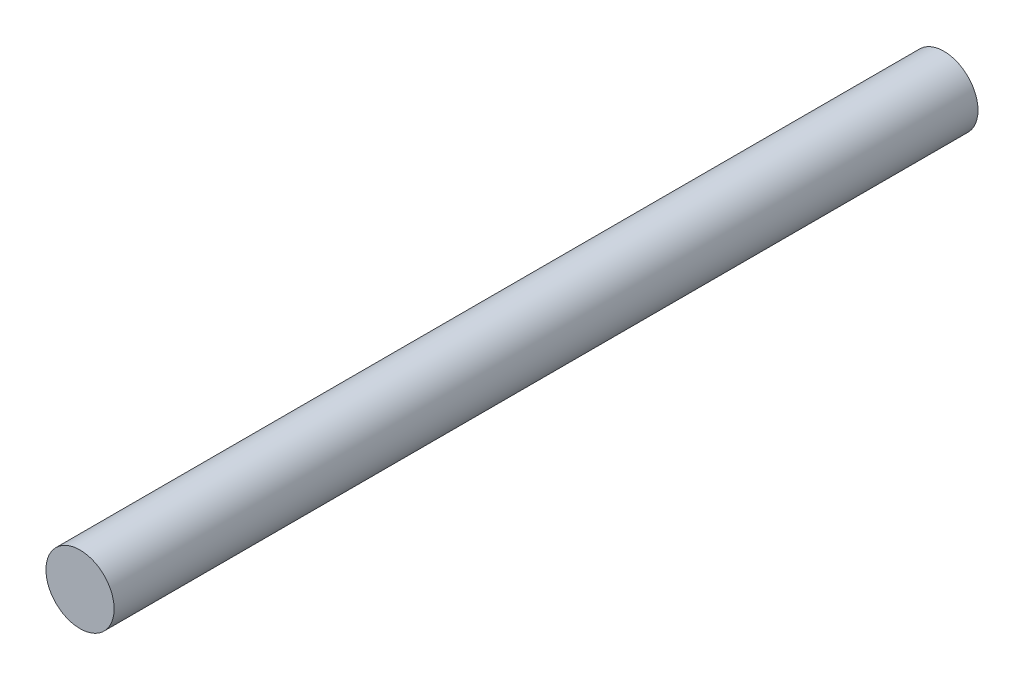
ISO-10303-21;
HEADER;
FILE_DESCRIPTION(('STEP AP214'),'2;1');
FILE_NAME('part.step','',(''),(''),'','','');
FILE_SCHEMA(('AUTOMOTIVE_DESIGN { 1 0 10303 214 1 1 1 1 }'));
ENDSEC;
DATA;
#1=APPLICATION_CONTEXT('core data for automotive mechanical design processes');
#2=APPLICATION_PROTOCOL_DEFINITION('international standard','automotive_design',2000,#1);
#3=PRODUCT_CONTEXT('',#1,'mechanical');
#4=PRODUCT('Part','Part','',(#3));
#5=PRODUCT_RELATED_PRODUCT_CATEGORY('part','',(#4));
#6=PRODUCT_DEFINITION_FORMATION('','',#4);
#7=PRODUCT_DEFINITION_CONTEXT('part definition',#1,'design');
#8=PRODUCT_DEFINITION('design','',#6,#7);
#9=PRODUCT_DEFINITION_SHAPE('','',#8);
#10=(LENGTH_UNIT() NAMED_UNIT(*) SI_UNIT(.MILLI.,.METRE.));
#11=(NAMED_UNIT(*) PLANE_ANGLE_UNIT() SI_UNIT($,.RADIAN.));
#12=(NAMED_UNIT(*) SI_UNIT($,.STERADIAN.) SOLID_ANGLE_UNIT());
#13=UNCERTAINTY_MEASURE_WITH_UNIT(LENGTH_MEASURE(1.E-05),#10,'distance_accuracy_value','');
#14=(GEOMETRIC_REPRESENTATION_CONTEXT(3) GLOBAL_UNCERTAINTY_ASSIGNED_CONTEXT((#13)) GLOBAL_UNIT_ASSIGNED_CONTEXT((#10,
#11,#12)) REPRESENTATION_CONTEXT('',''));
#15=CARTESIAN_POINT('',(0.,0.,0.));
#16=DIRECTION('',(0.,0.,1.));
#17=DIRECTION('',(1.,0.,0.));
#18=AXIS2_PLACEMENT_3D('',#15,#16,#17);
#19=CARTESIAN_POINT('',(0.,0.,38.));
#20=DIRECTION('',(0.,0.,-1.));
#21=DIRECTION('',(-1.,0.,0.));
#22=AXIS2_PLACEMENT_3D('',#19,#20,#21);
#23=CYLINDRICAL_SURFACE('',#22,1.5);
#24=CARTESIAN_POINT('',(0.,0.,38.));
#25=DIRECTION('',(0.,0.,1.));
#26=DIRECTION('',(1.,0.,0.));
#27=AXIS2_PLACEMENT_3D('',#24,#25,#26);
#28=CIRCLE('',#27,1.5);
#29=CARTESIAN_POINT('',(1.5,0.,38.));
#30=VERTEX_POINT('',#29);
#31=EDGE_CURVE('E10',#30,#30,#28,.T.);
#32=ORIENTED_EDGE('',*,*,#31,.F.);
#33=EDGE_LOOP('',(#32));
#34=FACE_BOUND('',#33,.T.);
#35=CARTESIAN_POINT('',(0.,0.,0.));
#36=DIRECTION('',(0.,0.,1.));
#37=DIRECTION('',(1.,0.,0.));
#38=AXIS2_PLACEMENT_3D('',#35,#36,#37);
#39=CIRCLE('',#38,1.5);
#40=CARTESIAN_POINT('',(1.5,0.,0.));
#41=VERTEX_POINT('',#40);
#42=EDGE_CURVE('E34',#41,#41,#39,.T.);
#43=ORIENTED_EDGE('',*,*,#42,.T.);
#44=EDGE_LOOP('',(#43));
#45=FACE_BOUND('',#44,.T.);
#46=ADVANCED_FACE('F31',(#34,#45),#23,.T.);
#47=CARTESIAN_POINT('',(0.,0.,38.));
#48=DIRECTION('',(0.,0.,1.));
#49=DIRECTION('',(1.,0.,0.));
#50=AXIS2_PLACEMENT_3D('',#47,#48,#49);
#51=PLANE('',#50);
#52=ORIENTED_EDGE('',*,*,#31,.T.);
#53=EDGE_LOOP('',(#52));
#54=FACE_BOUND('',#53,.T.);
#55=ADVANCED_FACE('F46',(#54),#51,.T.);
#56=CARTESIAN_POINT('',(0.,0.,0.));
#57=DIRECTION('',(0.,0.,1.));
#58=DIRECTION('',(1.,0.,0.));
#59=AXIS2_PLACEMENT_3D('',#56,#57,#58);
#60=PLANE('',#59);
#61=ORIENTED_EDGE('',*,*,#42,.F.);
#62=EDGE_LOOP('',(#61));
#63=FACE_BOUND('',#62,.T.);
#64=ADVANCED_FACE('F44',(#63),#60,.F.);
#65=CLOSED_SHELL('',(#46,#55,#64));
#66=MANIFOLD_SOLID_BREP('B2',#65);
#67=ADVANCED_BREP_SHAPE_REPRESENTATION('',(#18,#66),#14);
#68=SHAPE_DEFINITION_REPRESENTATION(#9,#67);
ENDSEC;
END-ISO-10303-21;
